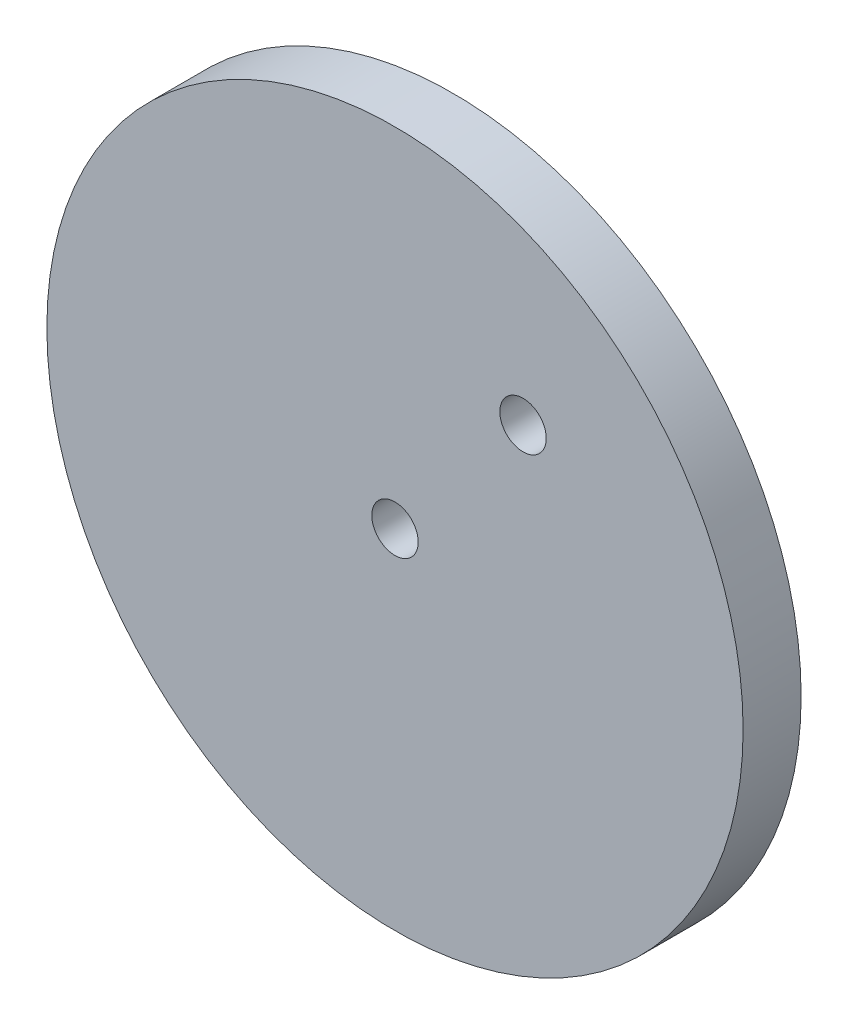
ISO-10303-21;
HEADER;
FILE_DESCRIPTION(('STEP AP214'),'2;1');
FILE_NAME('part.step','',(''),(''),'','','');
FILE_SCHEMA(('AUTOMOTIVE_DESIGN { 1 0 10303 214 1 1 1 1 }'));
ENDSEC;
DATA;
#1=APPLICATION_CONTEXT('core data for automotive mechanical design processes');
#2=APPLICATION_PROTOCOL_DEFINITION('international standard','automotive_design',2000,#1);
#3=PRODUCT_CONTEXT('',#1,'mechanical');
#4=PRODUCT('Part','Part','',(#3));
#5=PRODUCT_RELATED_PRODUCT_CATEGORY('part','',(#4));
#6=PRODUCT_DEFINITION_FORMATION('','',#4);
#7=PRODUCT_DEFINITION_CONTEXT('part definition',#1,'design');
#8=PRODUCT_DEFINITION('design','',#6,#7);
#9=PRODUCT_DEFINITION_SHAPE('','',#8);
#10=(LENGTH_UNIT() NAMED_UNIT(*) SI_UNIT(.MILLI.,.METRE.));
#11=(NAMED_UNIT(*) PLANE_ANGLE_UNIT() SI_UNIT($,.RADIAN.));
#12=(NAMED_UNIT(*) SI_UNIT($,.STERADIAN.) SOLID_ANGLE_UNIT());
#13=UNCERTAINTY_MEASURE_WITH_UNIT(LENGTH_MEASURE(1.E-05),#10,'distance_accuracy_value','');
#14=(GEOMETRIC_REPRESENTATION_CONTEXT(3) GLOBAL_UNCERTAINTY_ASSIGNED_CONTEXT((#13)) GLOBAL_UNIT_ASSIGNED_CONTEXT((#10,
#11,#12)) REPRESENTATION_CONTEXT('',''));
#15=CARTESIAN_POINT('',(0.,0.,0.));
#16=DIRECTION('',(0.,0.,1.));
#17=DIRECTION('',(1.,0.,0.));
#18=AXIS2_PLACEMENT_3D('',#15,#16,#17);
#19=CARTESIAN_POINT('',(0.,0.,5.));
#20=DIRECTION('',(0.,0.,-1.));
#21=DIRECTION('',(-1.,0.,0.));
#22=AXIS2_PLACEMENT_3D('',#19,#20,#21);
#23=CYLINDRICAL_SURFACE('',#22,30.);
#24=CARTESIAN_POINT('',(0.,0.,5.));
#25=DIRECTION('',(0.,0.,1.));
#26=DIRECTION('',(1.,0.,0.));
#27=AXIS2_PLACEMENT_3D('',#24,#25,#26);
#28=CIRCLE('',#27,30.);
#29=CARTESIAN_POINT('',(30.,0.,5.));
#30=VERTEX_POINT('',#29);
#31=EDGE_CURVE('E10',#30,#30,#28,.T.);
#32=ORIENTED_EDGE('',*,*,#31,.F.);
#33=EDGE_LOOP('',(#32));
#34=FACE_BOUND('',#33,.T.);
#35=CARTESIAN_POINT('',(0.,0.,0.));
#36=DIRECTION('',(0.,0.,1.));
#37=DIRECTION('',(1.,0.,0.));
#38=AXIS2_PLACEMENT_3D('',#35,#36,#37);
#39=CIRCLE('',#38,30.);
#40=CARTESIAN_POINT('',(30.,0.,0.));
#41=VERTEX_POINT('',#40);
#42=EDGE_CURVE('E39',#41,#41,#39,.T.);
#43=ORIENTED_EDGE('',*,*,#42,.T.);
#44=EDGE_LOOP('',(#43));
#45=FACE_BOUND('',#44,.T.);
#46=ADVANCED_FACE('F36',(#34,#45),#23,.T.);
#47=CARTESIAN_POINT('',(0.,0.,5.));
#48=DIRECTION('',(0.,0.,1.));
#49=DIRECTION('',(1.,0.,0.));
#50=AXIS2_PLACEMENT_3D('',#47,#48,#49);
#51=PLANE('',#50);
#52=CARTESIAN_POINT('',(0.,0.,5.));
#53=DIRECTION('',(0.,0.,1.));
#54=DIRECTION('',(1.,0.,0.));
#55=AXIS2_PLACEMENT_3D('',#52,#53,#54);
#56=CIRCLE('',#55,2.);
#57=CARTESIAN_POINT('',(2.,0.,5.));
#58=VERTEX_POINT('',#57);
#59=EDGE_CURVE('E54',#58,#58,#56,.T.);
#60=ORIENTED_EDGE('',*,*,#59,.F.);
#61=EDGE_LOOP('',(#60));
#62=FACE_BOUND('',#61,.T.);
#63=CARTESIAN_POINT('',(11.0352752632518,13.2584011051206,5.));
#64=DIRECTION('',(0.,0.,1.));
#65=DIRECTION('',(1.,0.,0.));
#66=AXIS2_PLACEMENT_3D('',#63,#64,#65);
#67=CIRCLE('',#66,2.);
#68=CARTESIAN_POINT('',(13.0352752632519,13.2584011051206,5.));
#69=VERTEX_POINT('',#68);
#70=EDGE_CURVE('E51',#69,#69,#67,.T.);
#71=ORIENTED_EDGE('',*,*,#70,.F.);
#72=EDGE_LOOP('',(#71));
#73=FACE_BOUND('',#72,.T.);
#74=ORIENTED_EDGE('',*,*,#31,.T.);
#75=EDGE_LOOP('',(#74));
#76=FACE_BOUND('',#75,.T.);
#77=ADVANCED_FACE('F70',(#62,#73,#76),#51,.T.);
#78=CARTESIAN_POINT('',(0.,0.,0.));
#79=DIRECTION('',(0.,0.,1.));
#80=DIRECTION('',(1.,0.,0.));
#81=AXIS2_PLACEMENT_3D('',#78,#79,#80);
#82=PLANE('',#81);
#83=CARTESIAN_POINT('',(0.,0.,0.));
#84=DIRECTION('',(0.,0.,1.));
#85=DIRECTION('',(1.,0.,0.));
#86=AXIS2_PLACEMENT_3D('',#83,#84,#85);
#87=CIRCLE('',#86,2.);
#88=CARTESIAN_POINT('',(2.,0.,0.));
#89=VERTEX_POINT('',#88);
#90=EDGE_CURVE('E46',#89,#89,#87,.T.);
#91=ORIENTED_EDGE('',*,*,#90,.T.);
#92=EDGE_LOOP('',(#91));
#93=FACE_BOUND('',#92,.T.);
#94=CARTESIAN_POINT('',(11.0352752632518,13.2584011051206,0.));
#95=DIRECTION('',(0.,0.,1.));
#96=DIRECTION('',(1.,0.,0.));
#97=AXIS2_PLACEMENT_3D('',#94,#95,#96);
#98=CIRCLE('',#97,2.);
#99=CARTESIAN_POINT('',(13.0352752632519,13.2584011051206,0.));
#100=VERTEX_POINT('',#99);
#101=EDGE_CURVE('E48',#100,#100,#98,.T.);
#102=ORIENTED_EDGE('',*,*,#101,.T.);
#103=EDGE_LOOP('',(#102));
#104=FACE_BOUND('',#103,.T.);
#105=ORIENTED_EDGE('',*,*,#42,.F.);
#106=EDGE_LOOP('',(#105));
#107=FACE_BOUND('',#106,.T.);
#108=ADVANCED_FACE('F60',(#93,#104,#107),#82,.F.);
#109=CARTESIAN_POINT('',(11.0352752632518,13.2584011051206,0.));
#110=DIRECTION('',(0.,0.,1.));
#111=DIRECTION('',(1.,0.,0.));
#112=AXIS2_PLACEMENT_3D('',#109,#110,#111);
#113=CYLINDRICAL_SURFACE('',#112,2.);
#114=ORIENTED_EDGE('',*,*,#101,.F.);
#115=EDGE_LOOP('',(#114));
#116=FACE_BOUND('',#115,.T.);
#117=ORIENTED_EDGE('',*,*,#70,.T.);
#118=EDGE_LOOP('',(#117));
#119=FACE_BOUND('',#118,.T.);
#120=ADVANCED_FACE('F66',(#116,#119),#113,.F.);
#121=CARTESIAN_POINT('',(0.,0.,0.));
#122=DIRECTION('',(0.,0.,1.));
#123=DIRECTION('',(1.,0.,0.));
#124=AXIS2_PLACEMENT_3D('',#121,#122,#123);
#125=CYLINDRICAL_SURFACE('',#124,2.);
#126=ORIENTED_EDGE('',*,*,#90,.F.);
#127=EDGE_LOOP('',(#126));
#128=FACE_BOUND('',#127,.T.);
#129=ORIENTED_EDGE('',*,*,#59,.T.);
#130=EDGE_LOOP('',(#129));
#131=FACE_BOUND('',#130,.T.);
#132=ADVANCED_FACE('F63',(#128,#131),#125,.F.);
#133=CLOSED_SHELL('',(#46,#77,#108,#120,#132));
#134=MANIFOLD_SOLID_BREP('B2',#133);
#135=ADVANCED_BREP_SHAPE_REPRESENTATION('',(#18,#134),#14);
#136=SHAPE_DEFINITION_REPRESENTATION(#9,#135);
ENDSEC;
END-ISO-10303-21;
